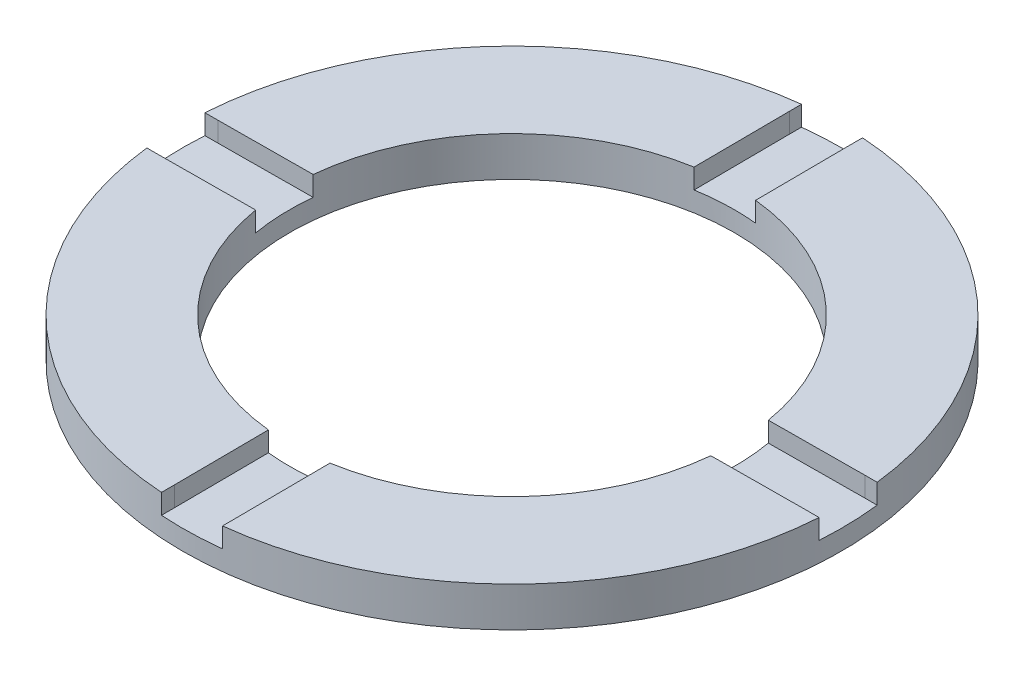
ISO-10303-21;
HEADER;
FILE_DESCRIPTION(('STEP AP214'),'2;1');
FILE_NAME('part.step','',(''),(''),'','','');
FILE_SCHEMA(('AUTOMOTIVE_DESIGN { 1 0 10303 214 1 1 1 1 }'));
ENDSEC;
DATA;
#1=APPLICATION_CONTEXT('core data for automotive mechanical design processes');
#2=APPLICATION_PROTOCOL_DEFINITION('international standard','automotive_design',2000,#1);
#3=PRODUCT_CONTEXT('',#1,'mechanical');
#4=PRODUCT('Part','Part','',(#3));
#5=PRODUCT_RELATED_PRODUCT_CATEGORY('part','',(#4));
#6=PRODUCT_DEFINITION_FORMATION('','',#4);
#7=PRODUCT_DEFINITION_CONTEXT('part definition',#1,'design');
#8=PRODUCT_DEFINITION('design','',#6,#7);
#9=PRODUCT_DEFINITION_SHAPE('','',#8);
#10=(LENGTH_UNIT() NAMED_UNIT(*) SI_UNIT(.MILLI.,.METRE.));
#11=(NAMED_UNIT(*) PLANE_ANGLE_UNIT() SI_UNIT($,.RADIAN.));
#12=(NAMED_UNIT(*) SI_UNIT($,.STERADIAN.) SOLID_ANGLE_UNIT());
#13=UNCERTAINTY_MEASURE_WITH_UNIT(LENGTH_MEASURE(1.E-05),#10,'distance_accuracy_value','');
#14=(GEOMETRIC_REPRESENTATION_CONTEXT(3) GLOBAL_UNCERTAINTY_ASSIGNED_CONTEXT((#13)) GLOBAL_UNIT_ASSIGNED_CONTEXT((#10,
#11,#12)) REPRESENTATION_CONTEXT('',''));
#15=CARTESIAN_POINT('',(0.,0.,0.));
#16=DIRECTION('',(0.,0.,1.));
#17=DIRECTION('',(1.,0.,0.));
#18=AXIS2_PLACEMENT_3D('',#15,#16,#17);
#19=CARTESIAN_POINT('',(0.,10.,0.));
#20=DIRECTION('',(0.,1.,0.));
#21=DIRECTION('',(0.,0.,1.));
#22=AXIS2_PLACEMENT_3D('',#19,#20,#21);
#23=PLANE('',#22);
#24=DIRECTION('',(0.99997676478456,0.,-0.00681688279234394));
#25=VECTOR('',#24,1.);
#26=CARTESIAN_POINT('',(-79.4318670656714,10.,9.52373344255748));
#27=LINE('',#26,#25);
#28=CARTESIAN_POINT('',(-79.4318670656714,10.,9.52373344255748));
#29=VERTEX_POINT('',#28);
#30=CARTESIAN_POINT('',(-55.2124629734585,10.,9.35862876731775));
#31=VERTEX_POINT('',#30);
#32=EDGE_CURVE('E231',#29,#31,#27,.T.);
#33=ORIENTED_EDGE('',*,*,#32,.F.);
#34=DIRECTION('',(-1.,0.,0.));
#35=VECTOR('',#34,1.);
#36=CARTESIAN_POINT('',(-79.4318670656714,10.,9.52373344255748));
#37=LINE('',#36,#35);
#38=CARTESIAN_POINT('',(-82.4517950157249,10.,9.52373344255743));
#39=VERTEX_POINT('',#38);
#40=EDGE_CURVE('E208',#29,#39,#37,.T.);
#41=ORIENTED_EDGE('',*,*,#40,.T.);
#42=CARTESIAN_POINT('',(0.,10.,0.));
#43=DIRECTION('',(0.,1.,0.));
#44=DIRECTION('',(0.,0.,1.));
#45=AXIS2_PLACEMENT_3D('',#42,#43,#44);
#46=CIRCLE('',#45,83.);
#47=CARTESIAN_POINT('',(-5.47587904749283,10.,82.8191689686466));
#48=VERTEX_POINT('',#47);
#49=EDGE_CURVE('E47',#39,#48,#46,.T.);
#50=ORIENTED_EDGE('',*,*,#49,.T.);
#51=DIRECTION('',(0.,0.,1.));
#52=VECTOR('',#51,1.);
#53=CARTESIAN_POINT('',(-5.47587904749281,10.,79.5398385828484));
#54=LINE('',#53,#52);
#55=CARTESIAN_POINT('',(-5.47587904749281,10.,79.5398385828484));
#56=VERTEX_POINT('',#55);
#57=EDGE_CURVE('E240',#56,#48,#54,.T.);
#58=ORIENTED_EDGE('',*,*,#57,.F.);
#59=DIRECTION('',(0.00681688279234684,0.,0.99997676478456));
#60=VECTOR('',#59,1.);
#61=CARTESIAN_POINT('',(-5.63829098936879,10.,55.7154347979019));
#62=LINE('',#61,#60);
#63=CARTESIAN_POINT('',(-5.6382909893688,10.,55.7154347979019));
#64=VERTEX_POINT('',#63);
#65=EDGE_CURVE('E268',#64,#56,#62,.T.);
#66=ORIENTED_EDGE('',*,*,#65,.F.);
#67=CARTESIAN_POINT('',(0.,10.,0.));
#68=DIRECTION('',(0.,-1.,0.));
#69=DIRECTION('',(0.,0.,-1.));
#70=AXIS2_PLACEMENT_3D('',#67,#68,#69);
#71=CIRCLE('',#70,56.0000000000066);
#72=EDGE_CURVE('E377',#64,#31,#71,.T.);
#73=ORIENTED_EDGE('',*,*,#72,.T.);
#74=EDGE_LOOP('',(#33,#41,#50,#58,#66,#73));
#75=FACE_BOUND('',#74,.T.);
#76=ADVANCED_FACE('F39',(#75),#23,.T.);
#77=DIRECTION('',(-0.00681688279234701,0.,-0.99997676478456));
#78=VECTOR('',#77,1.);
#79=CARTESIAN_POINT('',(9.52373344255742,10.,79.431867065672));
#80=LINE('',#79,#78);
#81=CARTESIAN_POINT('',(9.52373344255742,10.,79.431867065672));
#82=VERTEX_POINT('',#81);
#83=CARTESIAN_POINT('',(9.35862876731761,10.,55.2124629734591));
#84=VERTEX_POINT('',#83);
#85=EDGE_CURVE('E271',#82,#84,#80,.T.);
#86=ORIENTED_EDGE('',*,*,#85,.F.);
#87=DIRECTION('',(0.,0.,1.));
#88=VECTOR('',#87,1.);
#89=CARTESIAN_POINT('',(9.52373344255742,10.,79.431867065672));
#90=LINE('',#89,#88);
#91=CARTESIAN_POINT('',(9.52373344255745,10.,82.4517950157249));
#92=VERTEX_POINT('',#91);
#93=EDGE_CURVE('E273',#82,#92,#90,.T.);
#94=ORIENTED_EDGE('',*,*,#93,.T.);
#95=CARTESIAN_POINT('',(82.8191689686465,10.,5.4758790474942));
#96=VERTEX_POINT('',#95);
#97=EDGE_CURVE('E11',#92,#96,#46,.T.);
#98=ORIENTED_EDGE('',*,*,#97,.T.);
#99=DIRECTION('',(1.,0.,0.));
#100=VECTOR('',#99,1.);
#101=CARTESIAN_POINT('',(79.539838582848,10.,5.4758790474942));
#102=LINE('',#101,#100);
#103=CARTESIAN_POINT('',(79.539838582848,10.,5.4758790474942));
#104=VERTEX_POINT('',#103);
#105=EDGE_CURVE('E309',#104,#96,#102,.T.);
#106=ORIENTED_EDGE('',*,*,#105,.F.);
#107=DIRECTION('',(0.99997676478456,0.,-0.00681688279233606));
#108=VECTOR('',#107,1.);
#109=CARTESIAN_POINT('',(55.7154347979015,10.,5.63829098936993));
#110=LINE('',#109,#108);
#111=CARTESIAN_POINT('',(55.7154347979015,10.,5.63829098936993));
#112=VERTEX_POINT('',#111);
#113=EDGE_CURVE('E311',#112,#104,#110,.T.);
#114=ORIENTED_EDGE('',*,*,#113,.F.);
#115=EDGE_CURVE('E373',#112,#84,#71,.T.);
#116=ORIENTED_EDGE('',*,*,#115,.T.);
#117=EDGE_LOOP('',(#86,#94,#98,#106,#114,#116));
#118=FACE_BOUND('',#117,.T.);
#119=ADVANCED_FACE('F392',(#118),#23,.T.);
#120=DIRECTION('',(-0.99997676478456,0.,0.00681688279234385));
#121=VECTOR('',#120,1.);
#122=CARTESIAN_POINT('',(-55.7154347979013,10.,-5.63829098936865));
#123=LINE('',#122,#121);
#124=CARTESIAN_POINT('',(-55.7154347979013,10.,-5.63829098936865));
#125=VERTEX_POINT('',#124);
#126=CARTESIAN_POINT('',(-79.5398385828478,10.,-5.47587904749274));
#127=VERTEX_POINT('',#126);
#128=EDGE_CURVE('E223',#125,#127,#123,.T.);
#129=ORIENTED_EDGE('',*,*,#128,.F.);
#130=CARTESIAN_POINT('',(-9.35862876731739,10.,-55.2124629734582));
#131=VERTEX_POINT('',#130);
#132=EDGE_CURVE('E372',#125,#131,#71,.T.);
#133=ORIENTED_EDGE('',*,*,#132,.T.);
#134=DIRECTION('',(0.00681688279234724,0.,0.99997676478456));
#135=VECTOR('',#134,1.);
#136=CARTESIAN_POINT('',(-9.5237334425572,10.,-79.431867065671));
#137=LINE('',#136,#135);
#138=CARTESIAN_POINT('',(-9.5237334425572,10.,-79.431867065671));
#139=VERTEX_POINT('',#138);
#140=EDGE_CURVE('E308',#139,#131,#137,.T.);
#141=ORIENTED_EDGE('',*,*,#140,.F.);
#142=DIRECTION('',(0.,0.,-1.));
#143=VECTOR('',#142,1.);
#144=CARTESIAN_POINT('',(-9.5237334425572,10.,-79.431867065671));
#145=LINE('',#144,#143);
#146=CARTESIAN_POINT('',(-9.52373344255718,10.,-82.4517950157249));
#147=VERTEX_POINT('',#146);
#148=EDGE_CURVE('E347',#139,#147,#145,.T.);
#149=ORIENTED_EDGE('',*,*,#148,.T.);
#150=CARTESIAN_POINT('',(-82.8191689686466,10.,-5.47587904749274));
#151=VERTEX_POINT('',#150);
#152=EDGE_CURVE('E463',#147,#151,#46,.T.);
#153=ORIENTED_EDGE('',*,*,#152,.T.);
#154=DIRECTION('',(-1.,0.,0.));
#155=VECTOR('',#154,1.);
#156=CARTESIAN_POINT('',(-79.5398385828478,10.,-5.47587904749274));
#157=LINE('',#156,#155);
#158=EDGE_CURVE('E239',#127,#151,#157,.T.);
#159=ORIENTED_EDGE('',*,*,#158,.F.);
#160=EDGE_LOOP('',(#129,#133,#141,#149,#153,#159));
#161=FACE_BOUND('',#160,.T.);
#162=ADVANCED_FACE('F437',(#161),#23,.T.);
#163=CARTESIAN_POINT('',(0.,10.,0.));
#164=DIRECTION('',(0.,-1.,0.));
#165=DIRECTION('',(0.,0.,-1.));
#166=AXIS2_PLACEMENT_3D('',#163,#164,#165);
#167=CYLINDRICAL_SURFACE('',#166,83.);
#168=CARTESIAN_POINT('',(0.,5.,0.));
#169=DIRECTION('',(0.,1.,0.));
#170=DIRECTION('',(0.,0.,1.));
#171=AXIS2_PLACEMENT_3D('',#168,#169,#170);
#172=CIRCLE('',#171,83.);
#173=CARTESIAN_POINT('',(-82.8191689686466,5.,-5.47587904749274));
#174=VERTEX_POINT('',#173);
#175=CARTESIAN_POINT('',(-82.4517950157249,5.,9.52373344255743));
#176=VERTEX_POINT('',#175);
#177=EDGE_CURVE('E220',#174,#176,#172,.T.);
#178=ORIENTED_EDGE('',*,*,#177,.F.);
#179=DIRECTION('',(0.,1.,0.));
#180=VECTOR('',#179,1.);
#181=CARTESIAN_POINT('',(-82.8191689686466,5.,-5.47587904749274));
#182=LINE('',#181,#180);
#183=EDGE_CURVE('E247',#174,#151,#182,.T.);
#184=ORIENTED_EDGE('',*,*,#183,.T.);
#185=ORIENTED_EDGE('',*,*,#152,.F.);
#186=DIRECTION('',(0.,1.,0.));
#187=VECTOR('',#186,1.);
#188=CARTESIAN_POINT('',(-9.52373344255718,5.,-82.4517950157249));
#189=LINE('',#188,#187);
#190=CARTESIAN_POINT('',(-9.52373344255718,5.,-82.4517950157249));
#191=VERTEX_POINT('',#190);
#192=EDGE_CURVE('E345',#191,#147,#189,.T.);
#193=ORIENTED_EDGE('',*,*,#192,.F.);
#194=CARTESIAN_POINT('',(0.,5.,0.));
#195=DIRECTION('',(0.,1.,0.));
#196=DIRECTION('',(0.,0.,1.));
#197=AXIS2_PLACEMENT_3D('',#194,#195,#196);
#198=CIRCLE('',#197,83.);
#199=CARTESIAN_POINT('',(5.47587904749302,5.,-82.8191689686466));
#200=VERTEX_POINT('',#199);
#201=EDGE_CURVE('E360',#200,#191,#198,.T.);
#202=ORIENTED_EDGE('',*,*,#201,.F.);
#203=DIRECTION('',(0.,1.,0.));
#204=VECTOR('',#203,1.);
#205=CARTESIAN_POINT('',(5.47587904749302,5.,-82.8191689686466));
#206=LINE('',#205,#204);
#207=CARTESIAN_POINT('',(5.47587904749302,10.,-82.8191689686466));
#208=VERTEX_POINT('',#207);
#209=EDGE_CURVE('E338',#200,#208,#206,.T.);
#210=ORIENTED_EDGE('',*,*,#209,.T.);
#211=CARTESIAN_POINT('',(82.4517950157251,10.,-9.52373344255603));
#212=VERTEX_POINT('',#211);
#213=EDGE_CURVE('E48',#212,#208,#46,.T.);
#214=ORIENTED_EDGE('',*,*,#213,.F.);
#215=DIRECTION('',(0.,1.,0.));
#216=VECTOR('',#215,1.);
#217=CARTESIAN_POINT('',(82.4517950157251,5.,-9.52373344255603));
#218=LINE('',#217,#216);
#219=CARTESIAN_POINT('',(82.4517950157251,5.,-9.52373344255603));
#220=VERTEX_POINT('',#219);
#221=EDGE_CURVE('E305',#220,#212,#218,.T.);
#222=ORIENTED_EDGE('',*,*,#221,.F.);
#223=CARTESIAN_POINT('',(0.,5.,0.));
#224=DIRECTION('',(0.,1.,0.));
#225=DIRECTION('',(0.,0.,1.));
#226=AXIS2_PLACEMENT_3D('',#223,#224,#225);
#227=CIRCLE('',#226,83.);
#228=CARTESIAN_POINT('',(82.8191689686465,5.,5.4758790474942));
#229=VERTEX_POINT('',#228);
#230=EDGE_CURVE('E318',#229,#220,#227,.T.);
#231=ORIENTED_EDGE('',*,*,#230,.F.);
#232=DIRECTION('',(0.,1.,0.));
#233=VECTOR('',#232,1.);
#234=CARTESIAN_POINT('',(82.8191689686465,5.,5.4758790474942));
#235=LINE('',#234,#233);
#236=EDGE_CURVE('E298',#229,#96,#235,.T.);
#237=ORIENTED_EDGE('',*,*,#236,.T.);
#238=ORIENTED_EDGE('',*,*,#97,.F.);
#239=DIRECTION('',(0.,1.,0.));
#240=VECTOR('',#239,1.);
#241=CARTESIAN_POINT('',(9.52373344255745,5.,82.4517950157249));
#242=LINE('',#241,#240);
#243=CARTESIAN_POINT('',(9.52373344255745,5.,82.4517950157249));
#244=VERTEX_POINT('',#243);
#245=EDGE_CURVE('E258',#244,#92,#242,.T.);
#246=ORIENTED_EDGE('',*,*,#245,.F.);
#247=CARTESIAN_POINT('',(0.,5.,0.));
#248=DIRECTION('',(0.,1.,0.));
#249=DIRECTION('',(0.,0.,1.));
#250=AXIS2_PLACEMENT_3D('',#247,#248,#249);
#251=CIRCLE('',#250,83.);
#252=CARTESIAN_POINT('',(-5.47587904749283,5.,82.8191689686466));
#253=VERTEX_POINT('',#252);
#254=EDGE_CURVE('E287',#253,#244,#251,.T.);
#255=ORIENTED_EDGE('',*,*,#254,.F.);
#256=DIRECTION('',(0.,1.,0.));
#257=VECTOR('',#256,1.);
#258=CARTESIAN_POINT('',(-5.47587904749283,5.,82.8191689686466));
#259=LINE('',#258,#257);
#260=EDGE_CURVE('E252',#253,#48,#259,.T.);
#261=ORIENTED_EDGE('',*,*,#260,.T.);
#262=ORIENTED_EDGE('',*,*,#49,.F.);
#263=DIRECTION('',(0.,1.,0.));
#264=VECTOR('',#263,1.);
#265=CARTESIAN_POINT('',(-82.4517950157249,5.,9.52373344255743));
#266=LINE('',#265,#264);
#267=EDGE_CURVE('E215',#176,#39,#266,.T.);
#268=ORIENTED_EDGE('',*,*,#267,.F.);
#269=EDGE_LOOP('',(#178,#184,#185,#193,#202,#210,#214,#222,#231,#237,#238,#246,#255,#261,#262,#268));
#270=FACE_BOUND('',#269,.T.);
#271=CARTESIAN_POINT('',(0.,0.,0.));
#272=DIRECTION('',(0.,1.,0.));
#273=DIRECTION('',(0.,0.,1.));
#274=AXIS2_PLACEMENT_3D('',#271,#272,#273);
#275=CIRCLE('',#274,83.);
#276=CARTESIAN_POINT('',(0.,0.,83.));
#277=VERTEX_POINT('',#276);
#278=EDGE_CURVE('E43',#277,#277,#275,.T.);
#279=ORIENTED_EDGE('',*,*,#278,.T.);
#280=EDGE_LOOP('',(#279));
#281=FACE_BOUND('',#280,.T.);
#282=ADVANCED_FACE('F41',(#270,#281),#167,.T.);
#283=DIRECTION('',(-0.99997676478456,0.,0.00681688279233628));
#284=VECTOR('',#283,1.);
#285=CARTESIAN_POINT('',(79.4318670656717,10.,-9.52373344255602));
#286=LINE('',#285,#284);
#287=CARTESIAN_POINT('',(79.4318670656717,10.,-9.52373344255602));
#288=VERTEX_POINT('',#287);
#289=CARTESIAN_POINT('',(55.2124629734588,10.,-9.35862876731648));
#290=VERTEX_POINT('',#289);
#291=EDGE_CURVE('E270',#288,#290,#286,.T.);
#292=ORIENTED_EDGE('',*,*,#291,.F.);
#293=DIRECTION('',(1.,0.,0.));
#294=VECTOR('',#293,1.);
#295=CARTESIAN_POINT('',(79.4318670656717,10.,-9.52373344255602));
#296=LINE('',#295,#294);
#297=EDGE_CURVE('E307',#288,#212,#296,.T.);
#298=ORIENTED_EDGE('',*,*,#297,.T.);
#299=ORIENTED_EDGE('',*,*,#213,.T.);
#300=DIRECTION('',(0.,0.,-1.));
#301=VECTOR('',#300,1.);
#302=CARTESIAN_POINT('',(5.47587904749302,10.,-79.5398385828475));
#303=LINE('',#302,#301);
#304=CARTESIAN_POINT('',(5.47587904749302,10.,-79.5398385828475));
#305=VERTEX_POINT('',#304);
#306=EDGE_CURVE('E349',#305,#208,#303,.T.);
#307=ORIENTED_EDGE('',*,*,#306,.F.);
#308=DIRECTION('',(-0.00681688279234724,0.,-0.99997676478456));
#309=VECTOR('',#308,1.);
#310=CARTESIAN_POINT('',(5.63829098936901,10.,-55.715434797901));
#311=LINE('',#310,#309);
#312=CARTESIAN_POINT('',(5.63829098936902,10.,-55.715434797901));
#313=VERTEX_POINT('',#312);
#314=EDGE_CURVE('E355',#313,#305,#311,.T.);
#315=ORIENTED_EDGE('',*,*,#314,.F.);
#316=EDGE_CURVE('E367',#313,#290,#71,.T.);
#317=ORIENTED_EDGE('',*,*,#316,.T.);
#318=EDGE_LOOP('',(#292,#298,#299,#307,#315,#317));
#319=FACE_BOUND('',#318,.T.);
#320=ADVANCED_FACE('F433',(#319),#23,.T.);
#321=CARTESIAN_POINT('',(0.,0.,0.));
#322=DIRECTION('',(0.,1.,0.));
#323=DIRECTION('',(0.,0.,1.));
#324=AXIS2_PLACEMENT_3D('',#321,#322,#323);
#325=PLANE('',#324);
#326=CARTESIAN_POINT('',(0.,0.,0.));
#327=DIRECTION('',(0.,-1.,0.));
#328=DIRECTION('',(0.,0.,-1.));
#329=AXIS2_PLACEMENT_3D('',#326,#327,#328);
#330=CIRCLE('',#329,56.0000000000066);
#331=CARTESIAN_POINT('',(0.,0.,-56.0000000000066));
#332=VERTEX_POINT('',#331);
#333=EDGE_CURVE('E253',#332,#332,#330,.T.);
#334=ORIENTED_EDGE('',*,*,#333,.F.);
#335=EDGE_LOOP('',(#334));
#336=FACE_BOUND('',#335,.T.);
#337=ORIENTED_EDGE('',*,*,#278,.F.);
#338=EDGE_LOOP('',(#337));
#339=FACE_BOUND('',#338,.T.);
#340=ADVANCED_FACE('F442',(#336,#339),#325,.F.);
#341=CARTESIAN_POINT('',(0.,10.,0.));
#342=DIRECTION('',(0.,-1.,0.));
#343=DIRECTION('',(0.,0.,-1.));
#344=AXIS2_PLACEMENT_3D('',#341,#342,#343);
#345=CYLINDRICAL_SURFACE('',#344,56.0000000000066);
#346=CARTESIAN_POINT('',(-9.58656765082111E-10,5.,3.25841784110104E-11));
#347=DIRECTION('',(0.,1.,0.));
#348=DIRECTION('',(0.,0.,1.));
#349=AXIS2_PLACEMENT_3D('',#346,#347,#348);
#350=CIRCLE('',#349,55.9999999990494);
#351=CARTESIAN_POINT('',(-55.7154347979013,5.,-5.63829098936865));
#352=VERTEX_POINT('',#351);
#353=CARTESIAN_POINT('',(-55.2124629734651,5.,9.35862876731886));
#354=VERTEX_POINT('',#353);
#355=EDGE_CURVE('E224',#352,#354,#350,.T.);
#356=ORIENTED_EDGE('',*,*,#355,.T.);
#357=DIRECTION('',(0.,1.,0.));
#358=VECTOR('',#357,1.);
#359=CARTESIAN_POINT('',(-55.2124629734585,5.,9.35862876731775));
#360=LINE('',#359,#358);
#361=EDGE_CURVE('E211',#354,#31,#360,.T.);
#362=ORIENTED_EDGE('',*,*,#361,.T.);
#363=ORIENTED_EDGE('',*,*,#72,.F.);
#364=DIRECTION('',(0.,1.,0.));
#365=VECTOR('',#364,1.);
#366=CARTESIAN_POINT('',(-5.6382909893688,5.,55.7154347979019));
#367=LINE('',#366,#365);
#368=CARTESIAN_POINT('',(-5.6382909893688,5.,55.7154347979019));
#369=VERTEX_POINT('',#368);
#370=EDGE_CURVE('E263',#369,#64,#367,.T.);
#371=ORIENTED_EDGE('',*,*,#370,.F.);
#372=CARTESIAN_POINT('',(2.30199973666467E-11,5.,6.84327594591139E-10));
#373=DIRECTION('',(0.,1.,0.));
#374=DIRECTION('',(0.,0.,1.));
#375=AXIS2_PLACEMENT_3D('',#372,#373,#374);
#376=CIRCLE('',#375,55.9999999993219);
#377=CARTESIAN_POINT('',(9.35862876731864,5.,55.2124629734651));
#378=VERTEX_POINT('',#377);
#379=EDGE_CURVE('E278',#369,#378,#376,.T.);
#380=ORIENTED_EDGE('',*,*,#379,.T.);
#381=DIRECTION('',(0.,1.,0.));
#382=VECTOR('',#381,1.);
#383=CARTESIAN_POINT('',(9.35862876731761,5.,55.2124629734591));
#384=LINE('',#383,#382);
#385=EDGE_CURVE('E257',#378,#84,#384,.T.);
#386=ORIENTED_EDGE('',*,*,#385,.T.);
#387=ORIENTED_EDGE('',*,*,#115,.F.);
#388=DIRECTION('',(0.,1.,0.));
#389=VECTOR('',#388,1.);
#390=CARTESIAN_POINT('',(55.7154347979015,5.,5.63829098936993));
#391=LINE('',#390,#389);
#392=CARTESIAN_POINT('',(55.7154347979015,5.,5.63829098936993));
#393=VERTEX_POINT('',#392);
#394=EDGE_CURVE('E293',#393,#112,#391,.T.);
#395=ORIENTED_EDGE('',*,*,#394,.F.);
#396=CARTESIAN_POINT('',(7.17655102011605E-10,5.,-2.36282347854111E-11));
#397=DIRECTION('',(0.,-1.,0.));
#398=DIRECTION('',(0.,0.,-1.));
#399=AXIS2_PLACEMENT_3D('',#396,#397,#398);
#400=CIRCLE('',#399,55.9999999992885);
#401=CARTESIAN_POINT('',(55.2124629734655,5.,-9.35862876731652));
#402=VERTEX_POINT('',#401);
#403=EDGE_CURVE('E330',#402,#393,#400,.T.);
#404=ORIENTED_EDGE('',*,*,#403,.F.);
#405=DIRECTION('',(0.,1.,0.));
#406=VECTOR('',#405,1.);
#407=CARTESIAN_POINT('',(55.2124629734588,5.,-9.35862876731648));
#408=LINE('',#407,#406);
#409=EDGE_CURVE('E292',#402,#290,#408,.T.);
#410=ORIENTED_EDGE('',*,*,#409,.T.);
#411=ORIENTED_EDGE('',*,*,#316,.F.);
#412=DIRECTION('',(0.,1.,0.));
#413=VECTOR('',#412,1.);
#414=CARTESIAN_POINT('',(5.63829098936902,5.,-55.715434797901));
#415=LINE('',#414,#413);
#416=CARTESIAN_POINT('',(5.63829098936902,5.,-55.715434797901));
#417=VERTEX_POINT('',#416);
#418=EDGE_CURVE('E333',#417,#313,#415,.T.);
#419=ORIENTED_EDGE('',*,*,#418,.F.);
#420=CARTESIAN_POINT('',(-4.71729860035408E-11,5.,-1.41021916366668E-09));
#421=DIRECTION('',(0.,-1.,0.));
#422=DIRECTION('',(0.,0.,-1.));
#423=AXIS2_PLACEMENT_3D('',#420,#421,#422);
#424=CIRCLE('',#423,55.9999999986013);
#425=CARTESIAN_POINT('',(-9.35862876731744,5.,-55.2124629734653));
#426=VERTEX_POINT('',#425);
#427=EDGE_CURVE('E368',#426,#417,#424,.T.);
#428=ORIENTED_EDGE('',*,*,#427,.F.);
#429=DIRECTION('',(0.,1.,0.));
#430=VECTOR('',#429,1.);
#431=CARTESIAN_POINT('',(-9.35862876731739,5.,-55.2124629734582));
#432=LINE('',#431,#430);
#433=EDGE_CURVE('E332',#426,#131,#432,.T.);
#434=ORIENTED_EDGE('',*,*,#433,.T.);
#435=ORIENTED_EDGE('',*,*,#132,.F.);
#436=DIRECTION('',(0.,1.,0.));
#437=VECTOR('',#436,1.);
#438=CARTESIAN_POINT('',(-55.7154347979013,5.,-5.63829098936865));
#439=LINE('',#438,#437);
#440=EDGE_CURVE('E234',#352,#125,#439,.T.);
#441=ORIENTED_EDGE('',*,*,#440,.F.);
#442=EDGE_LOOP('',(#356,#362,#363,#371,#380,#386,#387,#395,#404,#410,#411,#419,#428,#434,#435,#441));
#443=FACE_BOUND('',#442,.T.);
#444=ORIENTED_EDGE('',*,*,#333,.T.);
#445=EDGE_LOOP('',(#444));
#446=FACE_BOUND('',#445,.T.);
#447=ADVANCED_FACE('F400',(#443,#446),#345,.F.);
#448=CARTESIAN_POINT('',(-9.5237334425572,5.,-79.431867065671));
#449=DIRECTION('',(-0.99997676478456,0.,0.00681688279234724));
#450=DIRECTION('',(0.00681688279234724,0.,0.99997676478456));
#451=AXIS2_PLACEMENT_3D('',#448,#449,#450);
#452=PLANE('',#451);
#453=ORIENTED_EDGE('',*,*,#140,.T.);
#454=ORIENTED_EDGE('',*,*,#433,.F.);
#455=DIRECTION('',(0.00681688279234724,0.,0.99997676478456));
#456=VECTOR('',#455,1.);
#457=CARTESIAN_POINT('',(-9.5237334425572,5.,-79.431867065671));
#458=LINE('',#457,#456);
#459=CARTESIAN_POINT('',(-9.5237334425572,5.,-79.431867065671));
#460=VERTEX_POINT('',#459);
#461=EDGE_CURVE('E348',#460,#426,#458,.T.);
#462=ORIENTED_EDGE('',*,*,#461,.F.);
#463=DIRECTION('',(0.,1.,0.));
#464=VECTOR('',#463,1.);
#465=CARTESIAN_POINT('',(-9.5237334425572,5.,-79.431867065671));
#466=LINE('',#465,#464);
#467=EDGE_CURVE('E344',#460,#139,#466,.T.);
#468=ORIENTED_EDGE('',*,*,#467,.T.);
#469=EDGE_LOOP('',(#453,#454,#462,#468));
#470=FACE_BOUND('',#469,.T.);
#471=ADVANCED_FACE('F461',(#470),#452,.F.);
#472=CARTESIAN_POINT('',(-9.5237334425572,5.,-79.431867065671));
#473=DIRECTION('',(1.,0.,0.));
#474=DIRECTION('',(0.,0.,-1.));
#475=AXIS2_PLACEMENT_3D('',#472,#473,#474);
#476=PLANE('',#475);
#477=ORIENTED_EDGE('',*,*,#148,.F.);
#478=ORIENTED_EDGE('',*,*,#467,.F.);
#479=DIRECTION('',(0.,0.,-1.));
#480=VECTOR('',#479,1.);
#481=CARTESIAN_POINT('',(-9.5237334425572,5.,-79.431867065671));
#482=LINE('',#481,#480);
#483=EDGE_CURVE('E331',#460,#191,#482,.T.);
#484=ORIENTED_EDGE('',*,*,#483,.T.);
#485=ORIENTED_EDGE('',*,*,#192,.T.);
#486=EDGE_LOOP('',(#477,#478,#484,#485));
#487=FACE_BOUND('',#486,.T.);
#488=ADVANCED_FACE('F530',(#487),#476,.T.);
#489=CARTESIAN_POINT('',(5.47587904749302,5.,-79.5398385828475));
#490=DIRECTION('',(1.,0.,0.));
#491=DIRECTION('',(0.,0.,-1.));
#492=AXIS2_PLACEMENT_3D('',#489,#490,#491);
#493=PLANE('',#492);
#494=ORIENTED_EDGE('',*,*,#306,.T.);
#495=ORIENTED_EDGE('',*,*,#209,.F.);
#496=DIRECTION('',(0.,0.,-1.));
#497=VECTOR('',#496,1.);
#498=CARTESIAN_POINT('',(5.47587904749302,5.,-79.5398385828475));
#499=LINE('',#498,#497);
#500=CARTESIAN_POINT('',(5.47587904749302,5.,-79.5398385828475));
#501=VERTEX_POINT('',#500);
#502=EDGE_CURVE('E356',#501,#200,#499,.T.);
#503=ORIENTED_EDGE('',*,*,#502,.F.);
#504=DIRECTION('',(0.,1.,0.));
#505=VECTOR('',#504,1.);
#506=CARTESIAN_POINT('',(5.47587904749302,5.,-79.5398385828475));
#507=LINE('',#506,#505);
#508=EDGE_CURVE('E340',#501,#305,#507,.T.);
#509=ORIENTED_EDGE('',*,*,#508,.T.);
#510=EDGE_LOOP('',(#494,#495,#503,#509));
#511=FACE_BOUND('',#510,.T.);
#512=ADVANCED_FACE('F533',(#511),#493,.F.);
#513=CARTESIAN_POINT('',(5.63829098936901,5.,-55.715434797901));
#514=DIRECTION('',(0.99997676478456,0.,-0.00681688279234724));
#515=DIRECTION('',(-0.00681688279234724,0.,-0.99997676478456));
#516=AXIS2_PLACEMENT_3D('',#513,#514,#515);
#517=PLANE('',#516);
#518=ORIENTED_EDGE('',*,*,#314,.T.);
#519=ORIENTED_EDGE('',*,*,#508,.F.);
#520=DIRECTION('',(-0.00681688279234724,0.,-0.99997676478456));
#521=VECTOR('',#520,1.);
#522=CARTESIAN_POINT('',(5.63829098936901,5.,-55.715434797901));
#523=LINE('',#522,#521);
#524=EDGE_CURVE('E361',#417,#501,#523,.T.);
#525=ORIENTED_EDGE('',*,*,#524,.F.);
#526=ORIENTED_EDGE('',*,*,#418,.T.);
#527=EDGE_LOOP('',(#518,#519,#525,#526));
#528=FACE_BOUND('',#527,.T.);
#529=ADVANCED_FACE('F520',(#528),#517,.F.);
#530=CARTESIAN_POINT('',(-4.71729860035408E-11,5.,-1.41021916366668E-09));
#531=DIRECTION('',(0.,-1.,0.));
#532=DIRECTION('',(0.,0.,-1.));
#533=AXIS2_PLACEMENT_3D('',#530,#531,#532);
#534=PLANE('',#533);
#535=ORIENTED_EDGE('',*,*,#461,.T.);
#536=ORIENTED_EDGE('',*,*,#427,.T.);
#537=ORIENTED_EDGE('',*,*,#524,.T.);
#538=ORIENTED_EDGE('',*,*,#502,.T.);
#539=ORIENTED_EDGE('',*,*,#201,.T.);
#540=ORIENTED_EDGE('',*,*,#483,.F.);
#541=EDGE_LOOP('',(#535,#536,#537,#538,#539,#540));
#542=FACE_BOUND('',#541,.T.);
#543=ADVANCED_FACE('F509',(#542),#534,.F.);
#544=CARTESIAN_POINT('',(79.4318670656717,5.,-9.52373344255602));
#545=DIRECTION('',(-0.00681688279233628,0.,-0.99997676478456));
#546=DIRECTION('',(-0.99997676478456,0.,0.00681688279233628));
#547=AXIS2_PLACEMENT_3D('',#544,#545,#546);
#548=PLANE('',#547);
#549=ORIENTED_EDGE('',*,*,#291,.T.);
#550=ORIENTED_EDGE('',*,*,#409,.F.);
#551=DIRECTION('',(-0.99997676478456,0.,0.00681688279233628));
#552=VECTOR('',#551,1.);
#553=CARTESIAN_POINT('',(79.4318670656717,5.,-9.52373344255602));
#554=LINE('',#553,#552);
#555=CARTESIAN_POINT('',(79.4318670656717,5.,-9.52373344255602));
#556=VERTEX_POINT('',#555);
#557=EDGE_CURVE('E313',#556,#402,#554,.T.);
#558=ORIENTED_EDGE('',*,*,#557,.F.);
#559=DIRECTION('',(0.,1.,0.));
#560=VECTOR('',#559,1.);
#561=CARTESIAN_POINT('',(79.4318670656717,5.,-9.52373344255602));
#562=LINE('',#561,#560);
#563=EDGE_CURVE('E304',#556,#288,#562,.T.);
#564=ORIENTED_EDGE('',*,*,#563,.T.);
#565=EDGE_LOOP('',(#549,#550,#558,#564));
#566=FACE_BOUND('',#565,.T.);
#567=ADVANCED_FACE('F510',(#566),#548,.F.);
#568=CARTESIAN_POINT('',(79.4318670656717,5.,-9.52373344255602));
#569=DIRECTION('',(0.,0.,1.));
#570=DIRECTION('',(1.,0.,0.));
#571=AXIS2_PLACEMENT_3D('',#568,#569,#570);
#572=PLANE('',#571);
#573=ORIENTED_EDGE('',*,*,#297,.F.);
#574=ORIENTED_EDGE('',*,*,#563,.F.);
#575=DIRECTION('',(1.,0.,0.));
#576=VECTOR('',#575,1.);
#577=CARTESIAN_POINT('',(79.4318670656717,5.,-9.52373344255602));
#578=LINE('',#577,#576);
#579=EDGE_CURVE('E294',#556,#220,#578,.T.);
#580=ORIENTED_EDGE('',*,*,#579,.T.);
#581=ORIENTED_EDGE('',*,*,#221,.T.);
#582=EDGE_LOOP('',(#573,#574,#580,#581));
#583=FACE_BOUND('',#582,.T.);
#584=ADVANCED_FACE('F428',(#583),#572,.T.);
#585=CARTESIAN_POINT('',(79.539838582848,5.,5.4758790474942));
#586=DIRECTION('',(0.,0.,1.));
#587=DIRECTION('',(1.,0.,0.));
#588=AXIS2_PLACEMENT_3D('',#585,#586,#587);
#589=PLANE('',#588);
#590=ORIENTED_EDGE('',*,*,#105,.T.);
#591=ORIENTED_EDGE('',*,*,#236,.F.);
#592=DIRECTION('',(1.,0.,0.));
#593=VECTOR('',#592,1.);
#594=CARTESIAN_POINT('',(79.539838582848,5.,5.4758790474942));
#595=LINE('',#594,#593);
#596=CARTESIAN_POINT('',(79.539838582848,5.,5.4758790474942));
#597=VERTEX_POINT('',#596);
#598=EDGE_CURVE('E321',#597,#229,#595,.T.);
#599=ORIENTED_EDGE('',*,*,#598,.F.);
#600=DIRECTION('',(0.,1.,0.));
#601=VECTOR('',#600,1.);
#602=CARTESIAN_POINT('',(79.539838582848,5.,5.4758790474942));
#603=LINE('',#602,#601);
#604=EDGE_CURVE('E300',#597,#104,#603,.T.);
#605=ORIENTED_EDGE('',*,*,#604,.T.);
#606=EDGE_LOOP('',(#590,#591,#599,#605));
#607=FACE_BOUND('',#606,.T.);
#608=ADVANCED_FACE('F414',(#607),#589,.F.);
#609=CARTESIAN_POINT('',(55.7154347979015,5.,5.63829098936993));
#610=DIRECTION('',(0.00681688279233606,0.,0.99997676478456));
#611=DIRECTION('',(0.99997676478456,0.,-0.00681688279233606));
#612=AXIS2_PLACEMENT_3D('',#609,#610,#611);
#613=PLANE('',#612);
#614=ORIENTED_EDGE('',*,*,#113,.T.);
#615=ORIENTED_EDGE('',*,*,#604,.F.);
#616=DIRECTION('',(0.99997676478456,0.,-0.00681688279233606));
#617=VECTOR('',#616,1.);
#618=CARTESIAN_POINT('',(55.7154347979015,5.,5.63829098936993));
#619=LINE('',#618,#617);
#620=EDGE_CURVE('E322',#393,#597,#619,.T.);
#621=ORIENTED_EDGE('',*,*,#620,.F.);
#622=ORIENTED_EDGE('',*,*,#394,.T.);
#623=EDGE_LOOP('',(#614,#615,#621,#622));
#624=FACE_BOUND('',#623,.T.);
#625=ADVANCED_FACE('F420',(#624),#613,.F.);
#626=CARTESIAN_POINT('',(7.17655102011605E-10,5.,-2.36282347854111E-11));
#627=DIRECTION('',(0.,-1.,0.));
#628=DIRECTION('',(0.,0.,-1.));
#629=AXIS2_PLACEMENT_3D('',#626,#627,#628);
#630=PLANE('',#629);
#631=ORIENTED_EDGE('',*,*,#557,.T.);
#632=ORIENTED_EDGE('',*,*,#403,.T.);
#633=ORIENTED_EDGE('',*,*,#620,.T.);
#634=ORIENTED_EDGE('',*,*,#598,.T.);
#635=ORIENTED_EDGE('',*,*,#230,.T.);
#636=ORIENTED_EDGE('',*,*,#579,.F.);
#637=EDGE_LOOP('',(#631,#632,#633,#634,#635,#636));
#638=FACE_BOUND('',#637,.T.);
#639=ADVANCED_FACE('F418',(#638),#630,.F.);
#640=CARTESIAN_POINT('',(-5.47587904749281,5.,79.5398385828484));
#641=DIRECTION('',(-1.,0.,0.));
#642=DIRECTION('',(0.,0.,1.));
#643=AXIS2_PLACEMENT_3D('',#640,#641,#642);
#644=PLANE('',#643);
#645=ORIENTED_EDGE('',*,*,#57,.T.);
#646=ORIENTED_EDGE('',*,*,#260,.F.);
#647=DIRECTION('',(0.,0.,1.));
#648=VECTOR('',#647,1.);
#649=CARTESIAN_POINT('',(-5.47587904749281,5.,79.5398385828484));
#650=LINE('',#649,#648);
#651=CARTESIAN_POINT('',(-5.47587904749281,5.,79.5398385828484));
#652=VERTEX_POINT('',#651);
#653=EDGE_CURVE('E275',#652,#253,#650,.T.);
#654=ORIENTED_EDGE('',*,*,#653,.F.);
#655=DIRECTION('',(0.,1.,0.));
#656=VECTOR('',#655,1.);
#657=CARTESIAN_POINT('',(-5.47587904749281,5.,79.5398385828484));
#658=LINE('',#657,#656);
#659=EDGE_CURVE('E264',#652,#56,#658,.T.);
#660=ORIENTED_EDGE('',*,*,#659,.T.);
#661=EDGE_LOOP('',(#645,#646,#654,#660));
#662=FACE_BOUND('',#661,.T.);
#663=ADVANCED_FACE('F426',(#662),#644,.F.);
#664=CARTESIAN_POINT('',(-5.63829098936879,5.,55.7154347979019));
#665=DIRECTION('',(-0.99997676478456,0.,0.00681688279234684));
#666=DIRECTION('',(0.00681688279234684,0.,0.99997676478456));
#667=AXIS2_PLACEMENT_3D('',#664,#665,#666);
#668=PLANE('',#667);
#669=ORIENTED_EDGE('',*,*,#65,.T.);
#670=ORIENTED_EDGE('',*,*,#659,.F.);
#671=DIRECTION('',(0.00681688279234684,0.,0.99997676478456));
#672=VECTOR('',#671,1.);
#673=CARTESIAN_POINT('',(-5.63829098936879,5.,55.7154347979019));
#674=LINE('',#673,#672);
#675=EDGE_CURVE('E254',#369,#652,#674,.T.);
#676=ORIENTED_EDGE('',*,*,#675,.F.);
#677=ORIENTED_EDGE('',*,*,#370,.T.);
#678=EDGE_LOOP('',(#669,#670,#676,#677));
#679=FACE_BOUND('',#678,.T.);
#680=ADVANCED_FACE('F477',(#679),#668,.F.);
#681=CARTESIAN_POINT('',(9.52373344255742,5.,79.431867065672));
#682=DIRECTION('',(0.99997676478456,0.,-0.00681688279234702));
#683=DIRECTION('',(-0.00681688279234702,0.,-0.99997676478456));
#684=AXIS2_PLACEMENT_3D('',#681,#682,#683);
#685=PLANE('',#684);
#686=ORIENTED_EDGE('',*,*,#85,.T.);
#687=ORIENTED_EDGE('',*,*,#385,.F.);
#688=DIRECTION('',(-0.00681688279234701,0.,-0.99997676478456));
#689=VECTOR('',#688,1.);
#690=CARTESIAN_POINT('',(9.52373344255742,5.,79.431867065672));
#691=LINE('',#690,#689);
#692=CARTESIAN_POINT('',(9.52373344255742,5.,79.431867065672));
#693=VERTEX_POINT('',#692);
#694=EDGE_CURVE('E63',#693,#378,#691,.T.);
#695=ORIENTED_EDGE('',*,*,#694,.F.);
#696=DIRECTION('',(0.,1.,0.));
#697=VECTOR('',#696,1.);
#698=CARTESIAN_POINT('',(9.52373344255742,5.,79.431867065672));
#699=LINE('',#698,#697);
#700=EDGE_CURVE('E256',#693,#82,#699,.T.);
#701=ORIENTED_EDGE('',*,*,#700,.T.);
#702=EDGE_LOOP('',(#686,#687,#695,#701));
#703=FACE_BOUND('',#702,.T.);
#704=ADVANCED_FACE('F402',(#703),#685,.F.);
#705=CARTESIAN_POINT('',(9.52373344255742,5.,79.431867065672));
#706=DIRECTION('',(-1.,0.,0.));
#707=DIRECTION('',(0.,0.,1.));
#708=AXIS2_PLACEMENT_3D('',#705,#706,#707);
#709=PLANE('',#708);
#710=ORIENTED_EDGE('',*,*,#93,.F.);
#711=ORIENTED_EDGE('',*,*,#700,.F.);
#712=DIRECTION('',(0.,0.,1.));
#713=VECTOR('',#712,1.);
#714=CARTESIAN_POINT('',(9.52373344255742,5.,79.431867065672));
#715=LINE('',#714,#713);
#716=EDGE_CURVE('E283',#693,#244,#715,.T.);
#717=ORIENTED_EDGE('',*,*,#716,.T.);
#718=ORIENTED_EDGE('',*,*,#245,.T.);
#719=EDGE_LOOP('',(#710,#711,#717,#718));
#720=FACE_BOUND('',#719,.T.);
#721=ADVANCED_FACE('F404',(#720),#709,.T.);
#722=CARTESIAN_POINT('',(0.,5.,0.));
#723=DIRECTION('',(0.,1.,0.));
#724=DIRECTION('',(0.,0.,1.));
#725=AXIS2_PLACEMENT_3D('',#722,#723,#724);
#726=PLANE('',#725);
#727=ORIENTED_EDGE('',*,*,#653,.T.);
#728=ORIENTED_EDGE('',*,*,#254,.T.);
#729=ORIENTED_EDGE('',*,*,#716,.F.);
#730=ORIENTED_EDGE('',*,*,#694,.T.);
#731=ORIENTED_EDGE('',*,*,#379,.F.);
#732=ORIENTED_EDGE('',*,*,#675,.T.);
#733=EDGE_LOOP('',(#727,#728,#729,#730,#731,#732));
#734=FACE_BOUND('',#733,.T.);
#735=ADVANCED_FACE('F480',(#734),#726,.T.);
#736=CARTESIAN_POINT('',(-79.4318670656714,5.,9.52373344255748));
#737=DIRECTION('',(0.00681688279234394,0.,0.99997676478456));
#738=DIRECTION('',(0.99997676478456,0.,-0.00681688279234394));
#739=AXIS2_PLACEMENT_3D('',#736,#737,#738);
#740=PLANE('',#739);
#741=ORIENTED_EDGE('',*,*,#32,.T.);
#742=ORIENTED_EDGE('',*,*,#361,.F.);
#743=DIRECTION('',(0.99997676478456,0.,-0.00681688279234394));
#744=VECTOR('',#743,1.);
#745=CARTESIAN_POINT('',(-79.4318670656714,5.,9.52373344255748));
#746=LINE('',#745,#744);
#747=CARTESIAN_POINT('',(-79.4318670656714,5.,9.52373344255748));
#748=VERTEX_POINT('',#747);
#749=EDGE_CURVE('E57',#748,#354,#746,.T.);
#750=ORIENTED_EDGE('',*,*,#749,.F.);
#751=DIRECTION('',(0.,1.,0.));
#752=VECTOR('',#751,1.);
#753=CARTESIAN_POINT('',(-79.4318670656714,5.,9.52373344255748));
#754=LINE('',#753,#752);
#755=EDGE_CURVE('E201',#748,#29,#754,.T.);
#756=ORIENTED_EDGE('',*,*,#755,.T.);
#757=EDGE_LOOP('',(#741,#742,#750,#756));
#758=FACE_BOUND('',#757,.T.);
#759=ADVANCED_FACE('F219',(#758),#740,.F.);
#760=CARTESIAN_POINT('',(-79.4318670656714,5.,9.52373344255748));
#761=DIRECTION('',(0.,0.,-1.));
#762=DIRECTION('',(-1.,0.,0.));
#763=AXIS2_PLACEMENT_3D('',#760,#761,#762);
#764=PLANE('',#763);
#765=ORIENTED_EDGE('',*,*,#40,.F.);
#766=ORIENTED_EDGE('',*,*,#755,.F.);
#767=DIRECTION('',(-1.,0.,0.));
#768=VECTOR('',#767,1.);
#769=CARTESIAN_POINT('',(-79.4318670656714,5.,9.52373344255748));
#770=LINE('',#769,#768);
#771=EDGE_CURVE('E202',#748,#176,#770,.T.);
#772=ORIENTED_EDGE('',*,*,#771,.T.);
#773=ORIENTED_EDGE('',*,*,#267,.T.);
#774=EDGE_LOOP('',(#765,#766,#772,#773));
#775=FACE_BOUND('',#774,.T.);
#776=ADVANCED_FACE('F204',(#775),#764,.T.);
#777=CARTESIAN_POINT('',(-79.5398385828478,5.,-5.47587904749274));
#778=DIRECTION('',(0.,0.,-1.));
#779=DIRECTION('',(-1.,0.,0.));
#780=AXIS2_PLACEMENT_3D('',#777,#778,#779);
#781=PLANE('',#780);
#782=ORIENTED_EDGE('',*,*,#158,.T.);
#783=ORIENTED_EDGE('',*,*,#183,.F.);
#784=DIRECTION('',(-1.,0.,0.));
#785=VECTOR('',#784,1.);
#786=CARTESIAN_POINT('',(-79.5398385828478,5.,-5.47587904749274));
#787=LINE('',#786,#785);
#788=CARTESIAN_POINT('',(-79.5398385828478,5.,-5.47587904749274));
#789=VERTEX_POINT('',#788);
#790=EDGE_CURVE('E228',#789,#174,#787,.T.);
#791=ORIENTED_EDGE('',*,*,#790,.F.);
#792=DIRECTION('',(0.,1.,0.));
#793=VECTOR('',#792,1.);
#794=CARTESIAN_POINT('',(-79.5398385828478,5.,-5.47587904749274));
#795=LINE('',#794,#793);
#796=EDGE_CURVE('E243',#789,#127,#795,.T.);
#797=ORIENTED_EDGE('',*,*,#796,.T.);
#798=EDGE_LOOP('',(#782,#783,#791,#797));
#799=FACE_BOUND('',#798,.T.);
#800=ADVANCED_FACE('F484',(#799),#781,.F.);
#801=CARTESIAN_POINT('',(-55.7154347979013,5.,-5.63829098936865));
#802=DIRECTION('',(-0.00681688279234385,0.,-0.99997676478456));
#803=DIRECTION('',(-0.99997676478456,0.,0.00681688279234385));
#804=AXIS2_PLACEMENT_3D('',#801,#802,#803);
#805=PLANE('',#804);
#806=ORIENTED_EDGE('',*,*,#128,.T.);
#807=ORIENTED_EDGE('',*,*,#796,.F.);
#808=DIRECTION('',(-0.99997676478456,0.,0.00681688279234385));
#809=VECTOR('',#808,1.);
#810=CARTESIAN_POINT('',(-55.7154347979013,5.,-5.63829098936865));
#811=LINE('',#810,#809);
#812=EDGE_CURVE('E232',#352,#789,#811,.T.);
#813=ORIENTED_EDGE('',*,*,#812,.F.);
#814=ORIENTED_EDGE('',*,*,#440,.T.);
#815=EDGE_LOOP('',(#806,#807,#813,#814));
#816=FACE_BOUND('',#815,.T.);
#817=ADVANCED_FACE('F485',(#816),#805,.F.);
#818=CARTESIAN_POINT('',(-9.58656765082111E-10,5.,3.25841784110104E-11));
#819=DIRECTION('',(0.,1.,0.));
#820=DIRECTION('',(0.,0.,1.));
#821=AXIS2_PLACEMENT_3D('',#818,#819,#820);
#822=PLANE('',#821);
#823=ORIENTED_EDGE('',*,*,#355,.F.);
#824=ORIENTED_EDGE('',*,*,#812,.T.);
#825=ORIENTED_EDGE('',*,*,#790,.T.);
#826=ORIENTED_EDGE('',*,*,#177,.T.);
#827=ORIENTED_EDGE('',*,*,#771,.F.);
#828=ORIENTED_EDGE('',*,*,#749,.T.);
#829=EDGE_LOOP('',(#823,#824,#825,#826,#827,#828));
#830=FACE_BOUND('',#829,.T.);
#831=ADVANCED_FACE('F212',(#830),#822,.T.);
#832=CLOSED_SHELL('',(#76,#119,#162,#282,#320,#340,#447,#471,#488,#512,#529,#543,#567,#584,#608,
#625,#639,#663,#680,#704,#721,#735,#759,#776,#800,#817,#831));
#833=MANIFOLD_SOLID_BREP('B2',#832);
#834=ADVANCED_BREP_SHAPE_REPRESENTATION('',(#18,#833),#14);
#835=SHAPE_DEFINITION_REPRESENTATION(#9,#834);
ENDSEC;
END-ISO-10303-21;
